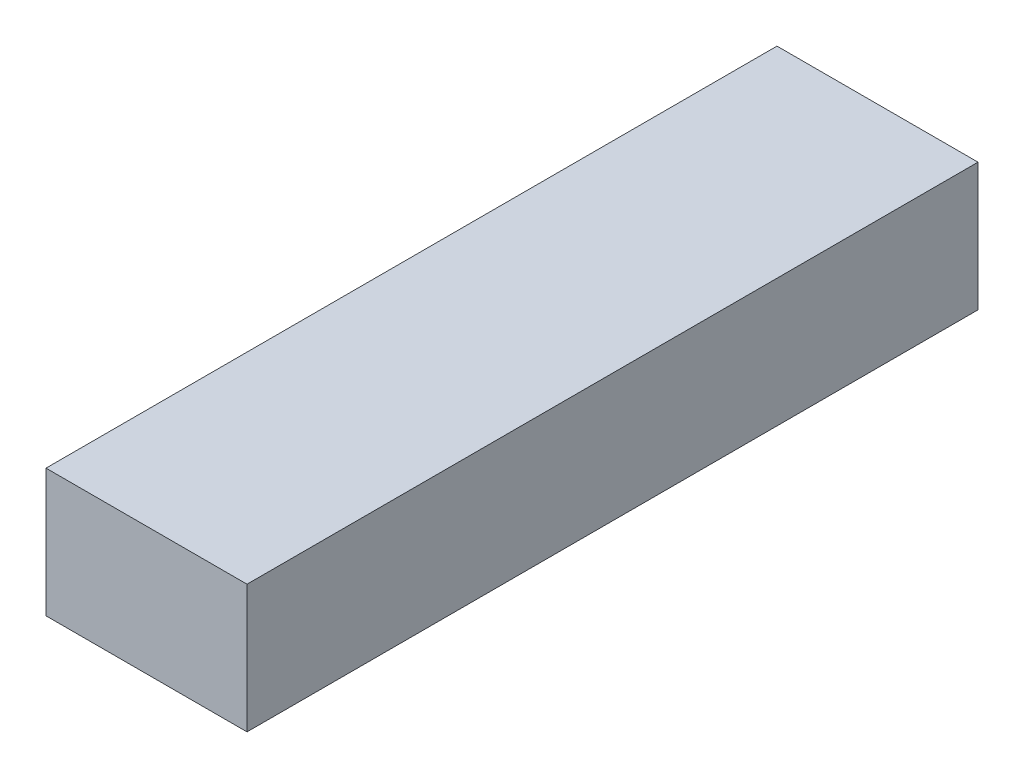
ISO-10303-21;
HEADER;
FILE_DESCRIPTION(('STEP AP214'),'2;1');
FILE_NAME('part.step','',(''),(''),'','','');
FILE_SCHEMA(('AUTOMOTIVE_DESIGN { 1 0 10303 214 1 1 1 1 }'));
ENDSEC;
DATA;
#1=APPLICATION_CONTEXT('core data for automotive mechanical design processes');
#2=APPLICATION_PROTOCOL_DEFINITION('international standard','automotive_design',2000,#1);
#3=PRODUCT_CONTEXT('',#1,'mechanical');
#4=PRODUCT('Part','Part','',(#3));
#5=PRODUCT_RELATED_PRODUCT_CATEGORY('part','',(#4));
#6=PRODUCT_DEFINITION_FORMATION('','',#4);
#7=PRODUCT_DEFINITION_CONTEXT('part definition',#1,'design');
#8=PRODUCT_DEFINITION('design','',#6,#7);
#9=PRODUCT_DEFINITION_SHAPE('','',#8);
#10=(LENGTH_UNIT() NAMED_UNIT(*) SI_UNIT(.MILLI.,.METRE.));
#11=(NAMED_UNIT(*) PLANE_ANGLE_UNIT() SI_UNIT($,.RADIAN.));
#12=(NAMED_UNIT(*) SI_UNIT($,.STERADIAN.) SOLID_ANGLE_UNIT());
#13=UNCERTAINTY_MEASURE_WITH_UNIT(LENGTH_MEASURE(1.E-05),#10,'distance_accuracy_value','');
#14=(GEOMETRIC_REPRESENTATION_CONTEXT(3) GLOBAL_UNCERTAINTY_ASSIGNED_CONTEXT((#13)) GLOBAL_UNIT_ASSIGNED_CONTEXT((#10,
#11,#12)) REPRESENTATION_CONTEXT('',''));
#15=CARTESIAN_POINT('',(0.,0.,0.));
#16=DIRECTION('',(0.,0.,1.));
#17=DIRECTION('',(1.,0.,0.));
#18=AXIS2_PLACEMENT_3D('',#15,#16,#17);
#19=CARTESIAN_POINT('',(11.,-7.,-80.));
#20=DIRECTION('',(1.,0.,0.));
#21=DIRECTION('',(0.,0.,-1.));
#22=AXIS2_PLACEMENT_3D('',#19,#20,#21);
#23=PLANE('',#22);
#24=DIRECTION('',(0.,1.,0.));
#25=VECTOR('',#24,1.);
#26=CARTESIAN_POINT('',(11.,-7.,0.));
#27=LINE('',#26,#25);
#28=CARTESIAN_POINT('',(11.,-7.,0.));
#29=VERTEX_POINT('',#28);
#30=CARTESIAN_POINT('',(11.,7.,0.));
#31=VERTEX_POINT('',#30);
#32=EDGE_CURVE('E100',#29,#31,#27,.T.);
#33=ORIENTED_EDGE('',*,*,#32,.F.);
#34=DIRECTION('',(0.,0.,1.));
#35=VECTOR('',#34,1.);
#36=CARTESIAN_POINT('',(11.,-7.,-80.));
#37=LINE('',#36,#35);
#38=CARTESIAN_POINT('',(11.,-7.,-80.));
#39=VERTEX_POINT('',#38);
#40=EDGE_CURVE('E11',#39,#29,#37,.T.);
#41=ORIENTED_EDGE('',*,*,#40,.F.);
#42=DIRECTION('',(0.,1.,0.));
#43=VECTOR('',#42,1.);
#44=CARTESIAN_POINT('',(11.,-7.,-80.));
#45=LINE('',#44,#43);
#46=CARTESIAN_POINT('',(11.,7.,-80.));
#47=VERTEX_POINT('',#46);
#48=EDGE_CURVE('E94',#39,#47,#45,.T.);
#49=ORIENTED_EDGE('',*,*,#48,.T.);
#50=DIRECTION('',(0.,0.,1.));
#51=VECTOR('',#50,1.);
#52=CARTESIAN_POINT('',(11.,7.,-80.));
#53=LINE('',#52,#51);
#54=EDGE_CURVE('E39',#47,#31,#53,.T.);
#55=ORIENTED_EDGE('',*,*,#54,.T.);
#56=EDGE_LOOP('',(#33,#41,#49,#55));
#57=FACE_BOUND('',#56,.T.);
#58=ADVANCED_FACE('F36',(#57),#23,.T.);
#59=CARTESIAN_POINT('',(-11.,-7.,-80.));
#60=DIRECTION('',(0.,-1.,0.));
#61=DIRECTION('',(0.,0.,-1.));
#62=AXIS2_PLACEMENT_3D('',#59,#60,#61);
#63=PLANE('',#62);
#64=DIRECTION('',(1.,0.,0.));
#65=VECTOR('',#64,1.);
#66=CARTESIAN_POINT('',(-11.,-7.,0.));
#67=LINE('',#66,#65);
#68=CARTESIAN_POINT('',(-11.,-7.,0.));
#69=VERTEX_POINT('',#68);
#70=EDGE_CURVE('E96',#69,#29,#67,.T.);
#71=ORIENTED_EDGE('',*,*,#70,.F.);
#72=DIRECTION('',(0.,0.,1.));
#73=VECTOR('',#72,1.);
#74=CARTESIAN_POINT('',(-11.,-7.,-80.));
#75=LINE('',#74,#73);
#76=CARTESIAN_POINT('',(-11.,-7.,-80.));
#77=VERTEX_POINT('',#76);
#78=EDGE_CURVE('E45',#77,#69,#75,.T.);
#79=ORIENTED_EDGE('',*,*,#78,.F.);
#80=DIRECTION('',(1.,0.,0.));
#81=VECTOR('',#80,1.);
#82=CARTESIAN_POINT('',(-11.,-7.,-80.));
#83=LINE('',#82,#81);
#84=EDGE_CURVE('E91',#77,#39,#83,.T.);
#85=ORIENTED_EDGE('',*,*,#84,.T.);
#86=ORIENTED_EDGE('',*,*,#40,.T.);
#87=EDGE_LOOP('',(#71,#79,#85,#86));
#88=FACE_BOUND('',#87,.T.);
#89=ADVANCED_FACE('F110',(#88),#63,.T.);
#90=CARTESIAN_POINT('',(-11.,-7.,-80.));
#91=DIRECTION('',(-1.,0.,0.));
#92=DIRECTION('',(0.,0.,1.));
#93=AXIS2_PLACEMENT_3D('',#90,#91,#92);
#94=PLANE('',#93);
#95=DIRECTION('',(0.,-1.,0.));
#96=VECTOR('',#95,1.);
#97=CARTESIAN_POINT('',(-11.,-7.,0.));
#98=LINE('',#97,#96);
#99=CARTESIAN_POINT('',(-11.,7.,0.));
#100=VERTEX_POINT('',#99);
#101=EDGE_CURVE('E86',#100,#69,#98,.T.);
#102=ORIENTED_EDGE('',*,*,#101,.F.);
#103=DIRECTION('',(0.,0.,1.));
#104=VECTOR('',#103,1.);
#105=CARTESIAN_POINT('',(-11.,7.,-80.));
#106=LINE('',#105,#104);
#107=CARTESIAN_POINT('',(-11.,7.,-80.));
#108=VERTEX_POINT('',#107);
#109=EDGE_CURVE('E81',#108,#100,#106,.T.);
#110=ORIENTED_EDGE('',*,*,#109,.F.);
#111=DIRECTION('',(0.,-1.,0.));
#112=VECTOR('',#111,1.);
#113=CARTESIAN_POINT('',(-11.,-7.,-80.));
#114=LINE('',#113,#112);
#115=EDGE_CURVE('E84',#108,#77,#114,.T.);
#116=ORIENTED_EDGE('',*,*,#115,.T.);
#117=ORIENTED_EDGE('',*,*,#78,.T.);
#118=EDGE_LOOP('',(#102,#110,#116,#117));
#119=FACE_BOUND('',#118,.T.);
#120=ADVANCED_FACE('F83',(#119),#94,.T.);
#121=CARTESIAN_POINT('',(-11.,7.,-80.));
#122=DIRECTION('',(0.,1.,0.));
#123=DIRECTION('',(0.,0.,1.));
#124=AXIS2_PLACEMENT_3D('',#121,#122,#123);
#125=PLANE('',#124);
#126=DIRECTION('',(-1.,0.,0.));
#127=VECTOR('',#126,1.);
#128=CARTESIAN_POINT('',(-11.,7.,0.));
#129=LINE('',#128,#127);
#130=EDGE_CURVE('E103',#31,#100,#129,.T.);
#131=ORIENTED_EDGE('',*,*,#130,.F.);
#132=ORIENTED_EDGE('',*,*,#54,.F.);
#133=DIRECTION('',(-1.,0.,0.));
#134=VECTOR('',#133,1.);
#135=CARTESIAN_POINT('',(-11.,7.,-80.));
#136=LINE('',#135,#134);
#137=EDGE_CURVE('E90',#47,#108,#136,.T.);
#138=ORIENTED_EDGE('',*,*,#137,.T.);
#139=ORIENTED_EDGE('',*,*,#109,.T.);
#140=EDGE_LOOP('',(#131,#132,#138,#139));
#141=FACE_BOUND('',#140,.T.);
#142=ADVANCED_FACE('F93',(#141),#125,.T.);
#143=CARTESIAN_POINT('',(0.,0.,-80.));
#144=DIRECTION('',(0.,0.,-1.));
#145=DIRECTION('',(-1.,0.,0.));
#146=AXIS2_PLACEMENT_3D('',#143,#144,#145);
#147=PLANE('',#146);
#148=ORIENTED_EDGE('',*,*,#48,.F.);
#149=ORIENTED_EDGE('',*,*,#84,.F.);
#150=ORIENTED_EDGE('',*,*,#115,.F.);
#151=ORIENTED_EDGE('',*,*,#137,.F.);
#152=EDGE_LOOP('',(#148,#149,#150,#151));
#153=FACE_BOUND('',#152,.T.);
#154=ADVANCED_FACE('F89',(#153),#147,.T.);
#155=CARTESIAN_POINT('',(0.,0.,0.));
#156=DIRECTION('',(0.,0.,-1.));
#157=DIRECTION('',(-1.,0.,0.));
#158=AXIS2_PLACEMENT_3D('',#155,#156,#157);
#159=PLANE('',#158);
#160=ORIENTED_EDGE('',*,*,#32,.T.);
#161=ORIENTED_EDGE('',*,*,#130,.T.);
#162=ORIENTED_EDGE('',*,*,#101,.T.);
#163=ORIENTED_EDGE('',*,*,#70,.T.);
#164=EDGE_LOOP('',(#160,#161,#162,#163));
#165=FACE_BOUND('',#164,.T.);
#166=ADVANCED_FACE('F109',(#165),#159,.F.);
#167=CLOSED_SHELL('',(#58,#89,#120,#142,#154,#166));
#168=MANIFOLD_SOLID_BREP('B2',#167);
#169=ADVANCED_BREP_SHAPE_REPRESENTATION('',(#18,#168),#14);
#170=SHAPE_DEFINITION_REPRESENTATION(#9,#169);
ENDSEC;
END-ISO-10303-21;
